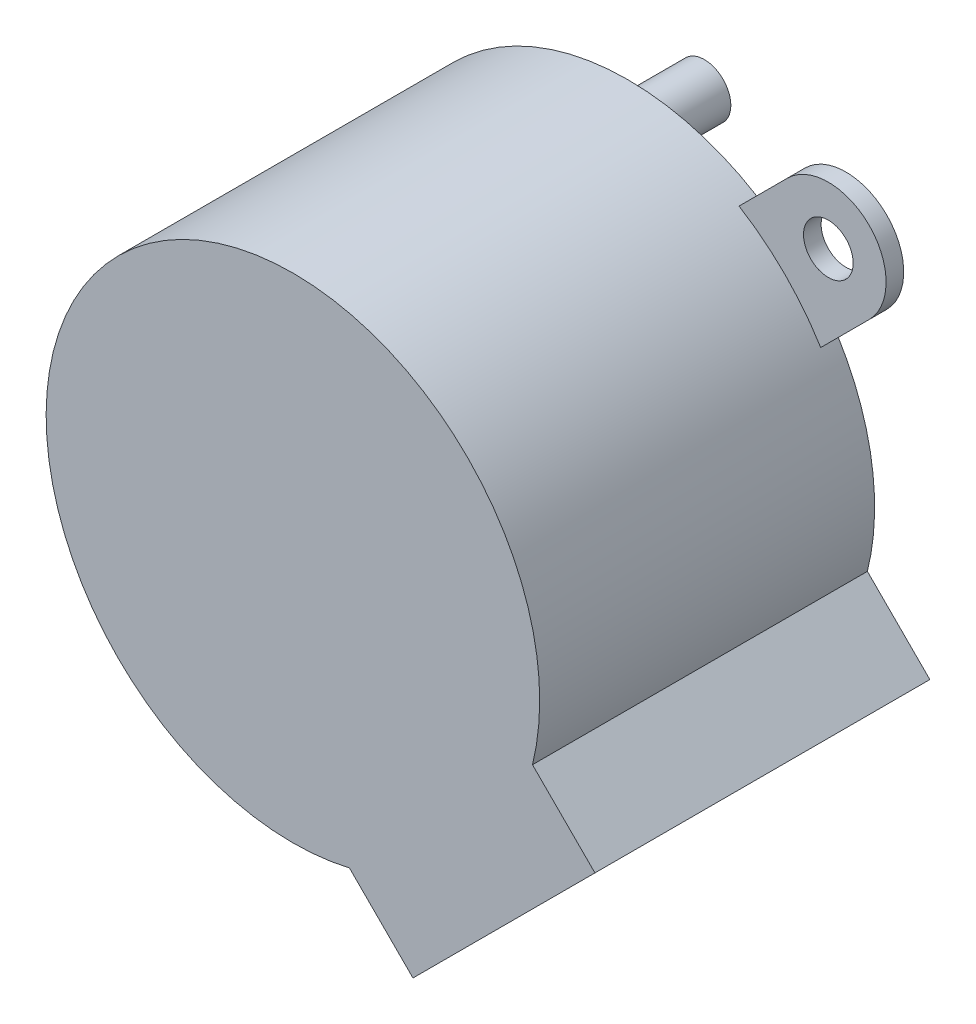
ISO-10303-21;
HEADER;
FILE_DESCRIPTION(('STEP AP214'),'2;1');
FILE_NAME('part.step','',(''),(''),'','','');
FILE_SCHEMA(('AUTOMOTIVE_DESIGN { 1 0 10303 214 1 1 1 1 }'));
ENDSEC;
DATA;
#1=APPLICATION_CONTEXT('core data for automotive mechanical design processes');
#2=APPLICATION_PROTOCOL_DEFINITION('international standard','automotive_design',2000,#1);
#3=PRODUCT_CONTEXT('',#1,'mechanical');
#4=PRODUCT('Part','Part','',(#3));
#5=PRODUCT_RELATED_PRODUCT_CATEGORY('part','',(#4));
#6=PRODUCT_DEFINITION_FORMATION('','',#4);
#7=PRODUCT_DEFINITION_CONTEXT('part definition',#1,'design');
#8=PRODUCT_DEFINITION('design','',#6,#7);
#9=PRODUCT_DEFINITION_SHAPE('','',#8);
#10=(LENGTH_UNIT() NAMED_UNIT(*) SI_UNIT(.MILLI.,.METRE.));
#11=(NAMED_UNIT(*) PLANE_ANGLE_UNIT() SI_UNIT($,.RADIAN.));
#12=(NAMED_UNIT(*) SI_UNIT($,.STERADIAN.) SOLID_ANGLE_UNIT());
#13=UNCERTAINTY_MEASURE_WITH_UNIT(LENGTH_MEASURE(1.E-05),#10,'distance_accuracy_value','');
#14=(GEOMETRIC_REPRESENTATION_CONTEXT(3) GLOBAL_UNCERTAINTY_ASSIGNED_CONTEXT((#13)) GLOBAL_UNIT_ASSIGNED_CONTEXT((#10,
#11,#12)) REPRESENTATION_CONTEXT('',''));
#15=CARTESIAN_POINT('',(0.,0.,0.));
#16=DIRECTION('',(0.,0.,1.));
#17=DIRECTION('',(1.,0.,0.));
#18=AXIS2_PLACEMENT_3D('',#15,#16,#17);
#19=CARTESIAN_POINT('',(39.0000952725,33.1973145386,13.0243098685));
#20=DIRECTION('',(0.,0.,1.));
#21=DIRECTION('',(1.,0.,0.));
#22=AXIS2_PLACEMENT_3D('',#19,#20,#21);
#23=PLANE('',#22);
#24=CARTESIAN_POINT('',(39.0000952725,33.1973145386,13.0243098685));
#25=DIRECTION('',(0.,0.,1.));
#26=DIRECTION('',(1.,0.,0.));
#27=AXIS2_PLACEMENT_3D('',#24,#25,#26);
#28=CIRCLE('',#27,1.5);
#29=CARTESIAN_POINT('',(40.5000952725,33.1973145386,13.0243098685));
#30=VERTEX_POINT('',#29);
#31=EDGE_CURVE('E11',#30,#30,#28,.T.);
#32=ORIENTED_EDGE('',*,*,#31,.F.);
#33=EDGE_LOOP('',(#32));
#34=FACE_BOUND('',#33,.T.);
#35=ADVANCED_FACE('F49',(#34),#23,.F.);
#36=CARTESIAN_POINT('',(39.0000952725,33.1973145386,18.0243098685));
#37=DIRECTION('',(0.,0.,1.));
#38=DIRECTION('',(0.707106781186548,-0.707106781186548,0.));
#39=AXIS2_PLACEMENT_3D('',#36,#37,#38);
#40=CYLINDRICAL_SURFACE('',#39,1.5);
#41=CARTESIAN_POINT('',(39.0000952725,33.1973145386,23.0243098685));
#42=DIRECTION('',(0.,0.,1.));
#43=DIRECTION('',(1.,0.,0.));
#44=AXIS2_PLACEMENT_3D('',#41,#42,#43);
#45=CIRCLE('',#44,1.5);
#46=CARTESIAN_POINT('',(40.5000952725,33.1973145386,23.0243098685));
#47=VERTEX_POINT('',#46);
#48=EDGE_CURVE('E236',#47,#47,#45,.T.);
#49=ORIENTED_EDGE('',*,*,#48,.F.);
#50=EDGE_LOOP('',(#49));
#51=FACE_BOUND('',#50,.T.);
#52=ORIENTED_EDGE('',*,*,#31,.T.);
#53=EDGE_LOOP('',(#52));
#54=FACE_BOUND('',#53,.T.);
#55=ADVANCED_FACE('F376',(#51,#54),#40,.T.);
#56=CARTESIAN_POINT('',(57.0313181928,39.9148289599,23.5243098685));
#57=DIRECTION('',(0.,0.,1.));
#58=DIRECTION('',(0.707106781186548,-0.707106781186548,0.));
#59=AXIS2_PLACEMENT_3D('',#56,#57,#58);
#60=CYLINDRICAL_SURFACE('',#59,1.40948287933);
#61=CARTESIAN_POINT('',(57.0313181928,39.9148289599,23.0243098685));
#62=DIRECTION('',(0.,0.,1.));
#63=DIRECTION('',(1.,0.,0.));
#64=AXIS2_PLACEMENT_3D('',#61,#62,#63);
#65=CIRCLE('',#64,1.40948287933);
#66=CARTESIAN_POINT('',(58.44080107213,39.9148289599,23.0243098685));
#67=VERTEX_POINT('',#66);
#68=EDGE_CURVE('E235',#67,#67,#65,.T.);
#69=ORIENTED_EDGE('',*,*,#68,.F.);
#70=EDGE_LOOP('',(#69));
#71=FACE_BOUND('',#70,.T.);
#72=CARTESIAN_POINT('',(57.0313181928,39.9148289599,24.0243098685));
#73=DIRECTION('',(0.,0.,1.));
#74=DIRECTION('',(1.,0.,0.));
#75=AXIS2_PLACEMENT_3D('',#72,#73,#74);
#76=CIRCLE('',#75,1.40948287933);
#77=CARTESIAN_POINT('',(58.44080107213,39.9148289599,24.0243098685));
#78=VERTEX_POINT('',#77);
#79=EDGE_CURVE('E266',#78,#78,#76,.T.);
#80=ORIENTED_EDGE('',*,*,#79,.T.);
#81=EDGE_LOOP('',(#80));
#82=FACE_BOUND('',#81,.T.);
#83=ADVANCED_FACE('F382',(#71,#82),#60,.F.);
#84=CARTESIAN_POINT('',(54.7147903766,42.2313567761,23.0243098685));
#85=DIRECTION('',(0.707106781186548,-0.707106781186548,0.));
#86=DIRECTION('',(0.,0.,-1.));
#87=AXIS2_PLACEMENT_3D('',#84,#85,#86);
#88=PLANE('',#87);
#89=DIRECTION('',(-0.707106781186548,-0.707106781186548,0.));
#90=VECTOR('',#89,1.);
#91=CARTESIAN_POINT('',(53.3399261386,40.856492538,23.0243098685));
#92=LINE('',#91,#90);
#93=CARTESIAN_POINT('',(54.7147903766,42.2313567761,23.0243098685));
#94=VERTEX_POINT('',#93);
#95=CARTESIAN_POINT('',(51.9650619005,39.4816283,23.0243098685));
#96=VERTEX_POINT('',#95);
#97=EDGE_CURVE('E319',#94,#96,#92,.T.);
#98=ORIENTED_EDGE('',*,*,#97,.T.);
#99=DIRECTION('',(0.,0.,-1.));
#100=VECTOR('',#99,1.);
#101=CARTESIAN_POINT('',(51.9650619005,39.4816283,33.0243098685));
#102=LINE('',#101,#100);
#103=CARTESIAN_POINT('',(51.9650619005,39.4816283,24.0243098685));
#104=VERTEX_POINT('',#103);
#105=EDGE_CURVE('E214',#104,#96,#102,.T.);
#106=ORIENTED_EDGE('',*,*,#105,.F.);
#107=DIRECTION('',(-0.707106781186548,-0.707106781186548,0.));
#108=VECTOR('',#107,1.);
#109=CARTESIAN_POINT('',(53.3399261386,40.856492538,24.0243098685));
#110=LINE('',#109,#108);
#111=CARTESIAN_POINT('',(54.7147903766,42.2313567761,24.0243098685));
#112=VERTEX_POINT('',#111);
#113=EDGE_CURVE('E52',#112,#104,#110,.T.);
#114=ORIENTED_EDGE('',*,*,#113,.F.);
#115=DIRECTION('',(0.,0.,-1.));
#116=VECTOR('',#115,1.);
#117=CARTESIAN_POINT('',(54.7147903766,42.2313567761,23.5243098685));
#118=LINE('',#117,#116);
#119=EDGE_CURVE('E58',#112,#94,#118,.T.);
#120=ORIENTED_EDGE('',*,*,#119,.T.);
#121=EDGE_LOOP('',(#98,#106,#114,#120));
#122=FACE_BOUND('',#121,.T.);
#123=ADVANCED_FACE('F318',(#122),#88,.F.);
#124=CARTESIAN_POINT('',(57.0313181928,39.9148289599,23.5243098685));
#125=DIRECTION('',(0.,0.,1.));
#126=DIRECTION('',(0.707106781186548,-0.707106781186548,0.));
#127=AXIS2_PLACEMENT_3D('',#124,#125,#126);
#128=CYLINDRICAL_SURFACE('',#127,3.27606505521);
#129=CARTESIAN_POINT('',(57.0313181928,39.9148289599,23.0243098685));
#130=DIRECTION('',(0.,0.,1.));
#131=DIRECTION('',(1.,0.,0.));
#132=AXIS2_PLACEMENT_3D('',#129,#130,#131);
#133=CIRCLE('',#132,3.27606505521);
#134=CARTESIAN_POINT('',(59.3478460089,37.5983011438,23.0243098685));
#135=VERTEX_POINT('',#134);
#136=EDGE_CURVE('E329',#135,#94,#133,.T.);
#137=ORIENTED_EDGE('',*,*,#136,.T.);
#138=ORIENTED_EDGE('',*,*,#119,.F.);
#139=CARTESIAN_POINT('',(57.0313181928,39.9148289599,24.0243098685));
#140=DIRECTION('',(0.,0.,1.));
#141=DIRECTION('',(1.,0.,0.));
#142=AXIS2_PLACEMENT_3D('',#139,#140,#141);
#143=CIRCLE('',#142,3.27606505521);
#144=CARTESIAN_POINT('',(59.3478460089,37.5983011438,24.0243098685));
#145=VERTEX_POINT('',#144);
#146=EDGE_CURVE('E76',#145,#112,#143,.T.);
#147=ORIENTED_EDGE('',*,*,#146,.F.);
#148=DIRECTION('',(0.,0.,-1.));
#149=VECTOR('',#148,1.);
#150=CARTESIAN_POINT('',(59.3478460089,37.5983011438,23.5243098685));
#151=LINE('',#150,#149);
#152=EDGE_CURVE('E221',#145,#135,#151,.T.);
#153=ORIENTED_EDGE('',*,*,#152,.T.);
#154=EDGE_LOOP('',(#137,#138,#147,#153));
#155=FACE_BOUND('',#154,.T.);
#156=ADVANCED_FACE('F328',(#155),#128,.T.);
#157=CARTESIAN_POINT('',(39.0000952725,33.1973145386,24.0243098685));
#158=DIRECTION('',(0.,0.,1.));
#159=DIRECTION('',(1.,0.,0.));
#160=AXIS2_PLACEMENT_3D('',#157,#158,#159);
#161=PLANE('',#160);
#162=ORIENTED_EDGE('',*,*,#79,.F.);
#163=EDGE_LOOP('',(#162));
#164=FACE_BOUND('',#163,.T.);
#165=DIRECTION('',(0.707106781186548,0.707106781186548,0.));
#166=VECTOR('',#165,1.);
#167=CARTESIAN_POINT('',(57.9729817709,36.2234369057,24.0243098685));
#168=LINE('',#167,#166);
#169=CARTESIAN_POINT('',(56.5981175328,34.8485726677,24.0243098685));
#170=VERTEX_POINT('',#169);
#171=EDGE_CURVE('E218',#170,#145,#168,.T.);
#172=ORIENTED_EDGE('',*,*,#171,.T.);
#173=ORIENTED_EDGE('',*,*,#146,.T.);
#174=ORIENTED_EDGE('',*,*,#113,.T.);
#175=CARTESIAN_POINT('',(44.656949522,27.5404602892,24.0243098685));
#176=DIRECTION('',(0.,0.,1.));
#177=DIRECTION('',(1.,0.,0.));
#178=AXIS2_PLACEMENT_3D('',#175,#176,#177);
#179=CIRCLE('',#178,14.);
#180=EDGE_CURVE('E285',#170,#104,#179,.T.);
#181=ORIENTED_EDGE('',*,*,#180,.F.);
#182=EDGE_LOOP('',(#172,#173,#174,#181));
#183=FACE_BOUND('',#182,.T.);
#184=ADVANCED_FACE('F314',(#164,#183),#161,.T.);
#185=CARTESIAN_POINT('',(56.5981175328,34.8485726677,23.0243098685));
#186=DIRECTION('',(-0.707106781186548,0.707106781186548,0.));
#187=DIRECTION('',(0.,0.,1.));
#188=AXIS2_PLACEMENT_3D('',#185,#186,#187);
#189=PLANE('',#188);
#190=DIRECTION('',(0.707106781186548,0.707106781186548,0.));
#191=VECTOR('',#190,1.);
#192=CARTESIAN_POINT('',(57.9729817709,36.2234369057,23.0243098685));
#193=LINE('',#192,#191);
#194=CARTESIAN_POINT('',(56.5981175328,34.8485726677,23.0243098685));
#195=VERTEX_POINT('',#194);
#196=EDGE_CURVE('E202',#195,#135,#193,.T.);
#197=ORIENTED_EDGE('',*,*,#196,.T.);
#198=ORIENTED_EDGE('',*,*,#152,.F.);
#199=ORIENTED_EDGE('',*,*,#171,.F.);
#200=DIRECTION('',(0.,0.,-1.));
#201=VECTOR('',#200,1.);
#202=CARTESIAN_POINT('',(56.5981175328,34.8485726677,33.0243098685));
#203=LINE('',#202,#201);
#204=EDGE_CURVE('E282',#170,#195,#203,.T.);
#205=ORIENTED_EDGE('',*,*,#204,.T.);
#206=EDGE_LOOP('',(#197,#198,#199,#205));
#207=FACE_BOUND('',#206,.T.);
#208=ADVANCED_FACE('F325',(#207),#189,.F.);
#209=CARTESIAN_POINT('',(39.0000952725,33.1973145386,24.0243098685));
#210=DIRECTION('',(0.,0.,1.));
#211=DIRECTION('',(1.,0.,0.));
#212=AXIS2_PLACEMENT_3D('',#209,#210,#211);
#213=PLANE('',#212);
#214=CARTESIAN_POINT('',(32.2825808512,15.1660916184,24.0243098685));
#215=DIRECTION('',(0.,0.,1.));
#216=DIRECTION('',(1.,0.,0.));
#217=AXIS2_PLACEMENT_3D('',#214,#215,#216);
#218=CIRCLE('',#217,1.40948287933);
#219=CARTESIAN_POINT('',(33.69206373053,15.1660916184,24.0243098685));
#220=VERTEX_POINT('',#219);
#221=EDGE_CURVE('E239',#220,#220,#218,.T.);
#222=ORIENTED_EDGE('',*,*,#221,.F.);
#223=EDGE_LOOP('',(#222));
#224=FACE_BOUND('',#223,.T.);
#225=DIRECTION('',(-0.707106781186548,-0.707106781186548,0.));
#226=VECTOR('',#225,1.);
#227=CARTESIAN_POINT('',(31.3409172731,18.8574836726,24.0243098685));
#228=LINE('',#227,#226);
#229=CARTESIAN_POINT('',(32.7157815112,20.2323479106,24.0243098685));
#230=VERTEX_POINT('',#229);
#231=CARTESIAN_POINT('',(29.9660530351,17.4826194345,24.0243098685));
#232=VERTEX_POINT('',#231);
#233=EDGE_CURVE('E301',#230,#232,#228,.T.);
#234=ORIENTED_EDGE('',*,*,#233,.T.);
#235=CARTESIAN_POINT('',(32.2825808512,15.1660916184,24.0243098685));
#236=DIRECTION('',(0.,0.,1.));
#237=DIRECTION('',(1.,0.,0.));
#238=AXIS2_PLACEMENT_3D('',#235,#236,#237);
#239=CIRCLE('',#238,3.27606505521);
#240=CARTESIAN_POINT('',(34.5991086674,12.8495638022,24.0243098685));
#241=VERTEX_POINT('',#240);
#242=EDGE_CURVE('E206',#232,#241,#239,.T.);
#243=ORIENTED_EDGE('',*,*,#242,.T.);
#244=DIRECTION('',(0.707106781186548,0.707106781186548,0.));
#245=VECTOR('',#244,1.);
#246=CARTESIAN_POINT('',(35.9739729054,14.2244280403,24.0243098685));
#247=LINE('',#246,#245);
#248=CARTESIAN_POINT('',(37.3488371435,15.5992922783,24.0243098685));
#249=VERTEX_POINT('',#248);
#250=EDGE_CURVE('E209',#241,#249,#247,.T.);
#251=ORIENTED_EDGE('',*,*,#250,.T.);
#252=CARTESIAN_POINT('',(44.656949522,27.5404602892,24.0243098685));
#253=DIRECTION('',(0.,0.,1.));
#254=DIRECTION('',(1.,0.,0.));
#255=AXIS2_PLACEMENT_3D('',#252,#253,#254);
#256=CIRCLE('',#255,14.);
#257=EDGE_CURVE('E275',#230,#249,#256,.T.);
#258=ORIENTED_EDGE('',*,*,#257,.F.);
#259=EDGE_LOOP('',(#234,#243,#251,#258));
#260=FACE_BOUND('',#259,.T.);
#261=ADVANCED_FACE('F362',(#224,#260),#213,.T.);
#262=CARTESIAN_POINT('',(32.2825808512,15.1660916184,23.5243098685));
#263=DIRECTION('',(0.,0.,1.));
#264=DIRECTION('',(0.707106781186548,-0.707106781186548,0.));
#265=AXIS2_PLACEMENT_3D('',#262,#263,#264);
#266=CYLINDRICAL_SURFACE('',#265,1.40948287933);
#267=CARTESIAN_POINT('',(32.2825808512,15.1660916184,23.0243098685));
#268=DIRECTION('',(0.,0.,1.));
#269=DIRECTION('',(1.,0.,0.));
#270=AXIS2_PLACEMENT_3D('',#267,#268,#269);
#271=CIRCLE('',#270,1.40948287933);
#272=CARTESIAN_POINT('',(33.69206373053,15.1660916184,23.0243098685));
#273=VERTEX_POINT('',#272);
#274=EDGE_CURVE('E231',#273,#273,#271,.T.);
#275=ORIENTED_EDGE('',*,*,#274,.F.);
#276=EDGE_LOOP('',(#275));
#277=FACE_BOUND('',#276,.T.);
#278=ORIENTED_EDGE('',*,*,#221,.T.);
#279=EDGE_LOOP('',(#278));
#280=FACE_BOUND('',#279,.T.);
#281=ADVANCED_FACE('F403',(#277,#280),#266,.F.);
#282=CARTESIAN_POINT('',(56.5981175328,34.8485726677,23.0243098685));
#283=DIRECTION('',(-0.707106781186548,0.707106781186548,0.));
#284=DIRECTION('',(0.,0.,1.));
#285=AXIS2_PLACEMENT_3D('',#282,#283,#284);
#286=PLANE('',#285);
#287=DIRECTION('',(0.707106781186548,0.707106781186548,0.));
#288=VECTOR('',#287,1.);
#289=CARTESIAN_POINT('',(35.9739729054,14.2244280403,23.0243098685));
#290=LINE('',#289,#288);
#291=CARTESIAN_POINT('',(34.5991086674,12.8495638022,23.0243098685));
#292=VERTEX_POINT('',#291);
#293=CARTESIAN_POINT('',(37.3488371435,15.5992922783,23.0243098685));
#294=VERTEX_POINT('',#293);
#295=EDGE_CURVE('E222',#292,#294,#290,.T.);
#296=ORIENTED_EDGE('',*,*,#295,.T.);
#297=DIRECTION('',(0.,0.,-1.));
#298=VECTOR('',#297,1.);
#299=CARTESIAN_POINT('',(37.3488371435,15.5992922783,33.0243098685));
#300=LINE('',#299,#298);
#301=EDGE_CURVE('E279',#249,#294,#300,.T.);
#302=ORIENTED_EDGE('',*,*,#301,.F.);
#303=ORIENTED_EDGE('',*,*,#250,.F.);
#304=DIRECTION('',(0.,0.,-1.));
#305=VECTOR('',#304,1.);
#306=CARTESIAN_POINT('',(34.5991086674,12.8495638022,23.5243098685));
#307=LINE('',#306,#305);
#308=EDGE_CURVE('E210',#241,#292,#307,.T.);
#309=ORIENTED_EDGE('',*,*,#308,.T.);
#310=EDGE_LOOP('',(#296,#302,#303,#309));
#311=FACE_BOUND('',#310,.T.);
#312=ADVANCED_FACE('F349',(#311),#286,.F.);
#313=CARTESIAN_POINT('',(32.2825808512,15.1660916184,23.5243098685));
#314=DIRECTION('',(0.,0.,1.));
#315=DIRECTION('',(-0.707106781186548,0.707106781186548,0.));
#316=AXIS2_PLACEMENT_3D('',#313,#314,#315);
#317=CYLINDRICAL_SURFACE('',#316,3.27606505521);
#318=CARTESIAN_POINT('',(32.2825808512,15.1660916184,23.0243098685));
#319=DIRECTION('',(0.,0.,1.));
#320=DIRECTION('',(1.,0.,0.));
#321=AXIS2_PLACEMENT_3D('',#318,#319,#320);
#322=CIRCLE('',#321,3.27606505521);
#323=CARTESIAN_POINT('',(29.9660530351,17.4826194345,23.0243098685));
#324=VERTEX_POINT('',#323);
#325=EDGE_CURVE('E226',#324,#292,#322,.T.);
#326=ORIENTED_EDGE('',*,*,#325,.T.);
#327=ORIENTED_EDGE('',*,*,#308,.F.);
#328=ORIENTED_EDGE('',*,*,#242,.F.);
#329=DIRECTION('',(0.,0.,-1.));
#330=VECTOR('',#329,1.);
#331=CARTESIAN_POINT('',(29.9660530351,17.4826194345,23.5243098685));
#332=LINE('',#331,#330);
#333=EDGE_CURVE('E180',#232,#324,#332,.T.);
#334=ORIENTED_EDGE('',*,*,#333,.T.);
#335=EDGE_LOOP('',(#326,#327,#328,#334));
#336=FACE_BOUND('',#335,.T.);
#337=ADVANCED_FACE('F355',(#336),#317,.T.);
#338=CARTESIAN_POINT('',(54.7147903766,42.2313567761,23.0243098685));
#339=DIRECTION('',(0.707106781186548,-0.707106781186548,0.));
#340=DIRECTION('',(0.,0.,-1.));
#341=AXIS2_PLACEMENT_3D('',#338,#339,#340);
#342=PLANE('',#341);
#343=DIRECTION('',(-0.707106781186548,-0.707106781186548,0.));
#344=VECTOR('',#343,1.);
#345=CARTESIAN_POINT('',(31.3409172731,18.8574836726,23.0243098685));
#346=LINE('',#345,#344);
#347=CARTESIAN_POINT('',(32.7157815112,20.2323479106,23.0243098685));
#348=VERTEX_POINT('',#347);
#349=EDGE_CURVE('E230',#348,#324,#346,.T.);
#350=ORIENTED_EDGE('',*,*,#349,.T.);
#351=ORIENTED_EDGE('',*,*,#333,.F.);
#352=ORIENTED_EDGE('',*,*,#233,.F.);
#353=DIRECTION('',(0.,0.,-1.));
#354=VECTOR('',#353,1.);
#355=CARTESIAN_POINT('',(32.7157815112,20.2323479106,33.0243098685));
#356=LINE('',#355,#354);
#357=EDGE_CURVE('E272',#230,#348,#356,.T.);
#358=ORIENTED_EDGE('',*,*,#357,.T.);
#359=EDGE_LOOP('',(#350,#351,#352,#358));
#360=FACE_BOUND('',#359,.T.);
#361=ADVANCED_FACE('F364',(#360),#342,.F.);
#362=CARTESIAN_POINT('',(58.2468203794,24.1766216965,24.0243098685));
#363=DIRECTION('',(0.707106781186548,0.707106781186548,0.));
#364=DIRECTION('',(0.,0.,-1.));
#365=AXIS2_PLACEMENT_3D('',#362,#363,#364);
#366=PLANE('',#365);
#367=DIRECTION('',(-0.707106781186548,0.707106781186548,0.));
#368=VECTOR('',#367,1.);
#369=CARTESIAN_POINT('',(60.018800657,22.4046414189,23.0243098685));
#370=LINE('',#369,#368);
#371=CARTESIAN_POINT('',(61.7907809345,20.6326611414,23.0243098685));
#372=VERTEX_POINT('',#371);
#373=CARTESIAN_POINT('',(58.2468203794,24.1766216965,23.0243098685));
#374=VERTEX_POINT('',#373);
#375=EDGE_CURVE('E172',#372,#374,#370,.T.);
#376=ORIENTED_EDGE('',*,*,#375,.T.);
#377=DIRECTION('',(0.,0.,-1.));
#378=VECTOR('',#377,1.);
#379=CARTESIAN_POINT('',(58.2468203794,24.1766216965,33.0243098685));
#380=LINE('',#379,#378);
#381=CARTESIAN_POINT('',(58.2468203794,24.1766216965,42.0243098685));
#382=VERTEX_POINT('',#381);
#383=EDGE_CURVE('E211',#382,#374,#380,.T.);
#384=ORIENTED_EDGE('',*,*,#383,.F.);
#385=DIRECTION('',(-0.707106781186548,0.707106781186548,0.));
#386=VECTOR('',#385,1.);
#387=CARTESIAN_POINT('',(60.018800657,22.4046414189,42.0243098685));
#388=LINE('',#387,#386);
#389=CARTESIAN_POINT('',(61.7907809345,20.6326611414,42.0243098685));
#390=VERTEX_POINT('',#389);
#391=EDGE_CURVE('E175',#390,#382,#388,.T.);
#392=ORIENTED_EDGE('',*,*,#391,.F.);
#393=DIRECTION('',(0.,0.,-1.));
#394=VECTOR('',#393,1.);
#395=CARTESIAN_POINT('',(61.7907809345,20.6326611414,32.5243098685));
#396=LINE('',#395,#394);
#397=EDGE_CURVE('E167',#390,#372,#396,.T.);
#398=ORIENTED_EDGE('',*,*,#397,.T.);
#399=EDGE_LOOP('',(#376,#384,#392,#398));
#400=FACE_BOUND('',#399,.T.);
#401=ADVANCED_FACE('F169',(#400),#366,.T.);
#402=CARTESIAN_POINT('',(61.7907809345,20.6326611414,24.0243098685));
#403=DIRECTION('',(0.707106781186548,-0.707106781186548,0.));
#404=DIRECTION('',(0.,0.,-1.));
#405=AXIS2_PLACEMENT_3D('',#402,#403,#404);
#406=PLANE('',#405);
#407=DIRECTION('',(0.707106781186548,0.707106781186548,0.));
#408=VECTOR('',#407,1.);
#409=CARTESIAN_POINT('',(56.6289014319,15.4707816387,23.0243098685));
#410=LINE('',#409,#408);
#411=CARTESIAN_POINT('',(51.4670219292,10.308902136,23.0243098685));
#412=VERTEX_POINT('',#411);
#413=EDGE_CURVE('E184',#412,#372,#410,.T.);
#414=ORIENTED_EDGE('',*,*,#413,.T.);
#415=ORIENTED_EDGE('',*,*,#397,.F.);
#416=DIRECTION('',(0.707106781186548,0.707106781186548,0.));
#417=VECTOR('',#416,1.);
#418=CARTESIAN_POINT('',(56.6289014319,15.4707816387,42.0243098685));
#419=LINE('',#418,#417);
#420=CARTESIAN_POINT('',(51.4670219292,10.308902136,42.0243098685));
#421=VERTEX_POINT('',#420);
#422=EDGE_CURVE('E244',#421,#390,#419,.T.);
#423=ORIENTED_EDGE('',*,*,#422,.F.);
#424=DIRECTION('',(0.,0.,-1.));
#425=VECTOR('',#424,1.);
#426=CARTESIAN_POINT('',(51.4670219292,10.308902136,32.5243098685));
#427=LINE('',#426,#425);
#428=EDGE_CURVE('E181',#421,#412,#427,.T.);
#429=ORIENTED_EDGE('',*,*,#428,.T.);
#430=EDGE_LOOP('',(#414,#415,#423,#429));
#431=FACE_BOUND('',#430,.T.);
#432=ADVANCED_FACE('F185',(#431),#406,.T.);
#433=CARTESIAN_POINT('',(51.4670219292,10.308902136,24.0243098685));
#434=DIRECTION('',(-0.707106781186548,-0.707106781186548,0.));
#435=DIRECTION('',(-0.707106781186548,0.707106781186548,0.));
#436=AXIS2_PLACEMENT_3D('',#433,#434,#435);
#437=PLANE('',#436);
#438=DIRECTION('',(0.707106781186548,-0.707106781186548,0.));
#439=VECTOR('',#438,1.);
#440=CARTESIAN_POINT('',(49.6651817031,12.1107423621,23.0243098685));
#441=LINE('',#440,#439);
#442=CARTESIAN_POINT('',(47.863341477,13.9125825883,23.0243098685));
#443=VERTEX_POINT('',#442);
#444=EDGE_CURVE('E190',#443,#412,#441,.T.);
#445=ORIENTED_EDGE('',*,*,#444,.T.);
#446=ORIENTED_EDGE('',*,*,#428,.F.);
#447=DIRECTION('',(0.707106781186548,-0.707106781186548,0.));
#448=VECTOR('',#447,1.);
#449=CARTESIAN_POINT('',(49.6651817031,12.1107423621,42.0243098685));
#450=LINE('',#449,#448);
#451=CARTESIAN_POINT('',(47.863341477,13.9125825883,42.0243098685));
#452=VERTEX_POINT('',#451);
#453=EDGE_CURVE('E240',#452,#421,#450,.T.);
#454=ORIENTED_EDGE('',*,*,#453,.F.);
#455=DIRECTION('',(0.,0.,-1.));
#456=VECTOR('',#455,1.);
#457=CARTESIAN_POINT('',(47.863341477,13.9125825883,33.0243098685));
#458=LINE('',#457,#456);
#459=EDGE_CURVE('E265',#452,#443,#458,.T.);
#460=ORIENTED_EDGE('',*,*,#459,.T.);
#461=EDGE_LOOP('',(#445,#446,#454,#460));
#462=FACE_BOUND('',#461,.T.);
#463=ADVANCED_FACE('F487',(#462),#437,.T.);
#464=CARTESIAN_POINT('',(44.656949522,27.5404602892,33.0243098685));
#465=DIRECTION('',(0.,0.,1.));
#466=DIRECTION('',(0.707106781186548,-0.707106781186548,0.));
#467=AXIS2_PLACEMENT_3D('',#464,#465,#466);
#468=CYLINDRICAL_SURFACE('',#467,14.);
#469=CARTESIAN_POINT('',(44.656949522,27.5404602892,23.0243098685));
#470=DIRECTION('',(0.,0.,1.));
#471=DIRECTION('',(1.,0.,0.));
#472=AXIS2_PLACEMENT_3D('',#469,#470,#471);
#473=CIRCLE('',#472,14.);
#474=EDGE_CURVE('E217',#294,#443,#473,.T.);
#475=ORIENTED_EDGE('',*,*,#474,.T.);
#476=ORIENTED_EDGE('',*,*,#459,.F.);
#477=CARTESIAN_POINT('',(44.656949522,27.5404602892,42.0243098685));
#478=DIRECTION('',(0.,0.,1.));
#479=DIRECTION('',(1.,0.,0.));
#480=AXIS2_PLACEMENT_3D('',#477,#478,#479);
#481=CIRCLE('',#480,14.);
#482=EDGE_CURVE('E245',#382,#452,#481,.T.);
#483=ORIENTED_EDGE('',*,*,#482,.F.);
#484=ORIENTED_EDGE('',*,*,#383,.T.);
#485=CARTESIAN_POINT('',(44.656949522,27.5404602892,23.0243098685));
#486=DIRECTION('',(0.,0.,1.));
#487=DIRECTION('',(1.,0.,0.));
#488=AXIS2_PLACEMENT_3D('',#485,#486,#487);
#489=CIRCLE('',#488,14.);
#490=EDGE_CURVE('E196',#374,#195,#489,.T.);
#491=ORIENTED_EDGE('',*,*,#490,.T.);
#492=ORIENTED_EDGE('',*,*,#204,.F.);
#493=ORIENTED_EDGE('',*,*,#180,.T.);
#494=ORIENTED_EDGE('',*,*,#105,.T.);
#495=CARTESIAN_POINT('',(44.656949522,27.5404602892,23.0243098685));
#496=DIRECTION('',(0.,0.,1.));
#497=DIRECTION('',(1.,0.,0.));
#498=AXIS2_PLACEMENT_3D('',#495,#496,#497);
#499=CIRCLE('',#498,14.);
#500=EDGE_CURVE('E246',#96,#348,#499,.T.);
#501=ORIENTED_EDGE('',*,*,#500,.T.);
#502=ORIENTED_EDGE('',*,*,#357,.F.);
#503=ORIENTED_EDGE('',*,*,#257,.T.);
#504=ORIENTED_EDGE('',*,*,#301,.T.);
#505=EDGE_LOOP('',(#475,#476,#483,#484,#491,#492,#493,#494,#501,#502,#503,#504));
#506=FACE_BOUND('',#505,.T.);
#507=ADVANCED_FACE('F322',(#506),#468,.T.);
#508=CARTESIAN_POINT('',(39.0000952725,33.1973145386,42.0243098685));
#509=DIRECTION('',(0.,0.,1.));
#510=DIRECTION('',(1.,0.,0.));
#511=AXIS2_PLACEMENT_3D('',#508,#509,#510);
#512=PLANE('',#511);
#513=ORIENTED_EDGE('',*,*,#482,.T.);
#514=ORIENTED_EDGE('',*,*,#453,.T.);
#515=ORIENTED_EDGE('',*,*,#422,.T.);
#516=ORIENTED_EDGE('',*,*,#391,.T.);
#517=EDGE_LOOP('',(#513,#514,#515,#516));
#518=FACE_BOUND('',#517,.T.);
#519=ADVANCED_FACE('F515',(#518),#512,.T.);
#520=CARTESIAN_POINT('',(39.0000952725,33.1973145386,23.0243098685));
#521=DIRECTION('',(0.,0.,1.));
#522=DIRECTION('',(1.,0.,0.));
#523=AXIS2_PLACEMENT_3D('',#520,#521,#522);
#524=PLANE('',#523);
#525=ORIENTED_EDGE('',*,*,#68,.T.);
#526=EDGE_LOOP('',(#525));
#527=FACE_BOUND('',#526,.T.);
#528=ORIENTED_EDGE('',*,*,#274,.T.);
#529=EDGE_LOOP('',(#528));
#530=FACE_BOUND('',#529,.T.);
#531=ORIENTED_EDGE('',*,*,#48,.T.);
#532=EDGE_LOOP('',(#531));
#533=FACE_BOUND('',#532,.T.);
#534=ORIENTED_EDGE('',*,*,#97,.F.);
#535=ORIENTED_EDGE('',*,*,#136,.F.);
#536=ORIENTED_EDGE('',*,*,#196,.F.);
#537=ORIENTED_EDGE('',*,*,#490,.F.);
#538=ORIENTED_EDGE('',*,*,#375,.F.);
#539=ORIENTED_EDGE('',*,*,#413,.F.);
#540=ORIENTED_EDGE('',*,*,#444,.F.);
#541=ORIENTED_EDGE('',*,*,#474,.F.);
#542=ORIENTED_EDGE('',*,*,#295,.F.);
#543=ORIENTED_EDGE('',*,*,#325,.F.);
#544=ORIENTED_EDGE('',*,*,#349,.F.);
#545=ORIENTED_EDGE('',*,*,#500,.F.);
#546=EDGE_LOOP('',(#534,#535,#536,#537,#538,#539,#540,#541,#542,#543,#544,#545));
#547=FACE_BOUND('',#546,.T.);
#548=ADVANCED_FACE('F193',(#527,#530,#533,#547),#524,.F.);
#549=CLOSED_SHELL('',(#35,#55,#83,#123,#156,#184,#208,#261,#281,#312,#337,#361,#401,#432,#463,
#507,#519,#548));
#550=MANIFOLD_SOLID_BREP('B2',#549);
#551=ADVANCED_BREP_SHAPE_REPRESENTATION('',(#18,#550),#14);
#552=SHAPE_DEFINITION_REPRESENTATION(#9,#551);
ENDSEC;
END-ISO-10303-21;
